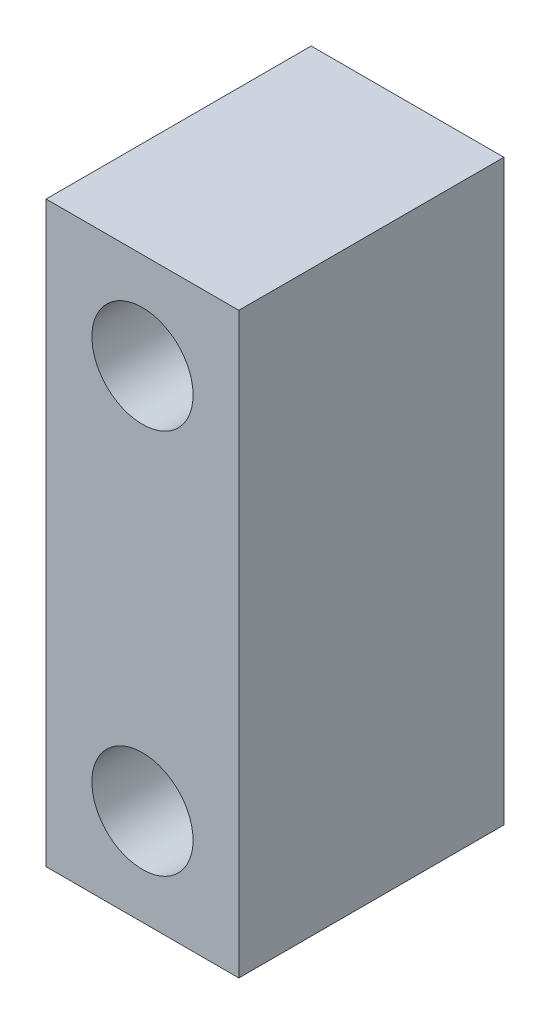
ISO-10303-21;
HEADER;
FILE_DESCRIPTION(('STEP AP214'),'2;1');
FILE_NAME('part.step','',(''),(''),'','','');
FILE_SCHEMA(('AUTOMOTIVE_DESIGN { 1 0 10303 214 1 1 1 1 }'));
ENDSEC;
DATA;
#1=APPLICATION_CONTEXT('core data for automotive mechanical design processes');
#2=APPLICATION_PROTOCOL_DEFINITION('international standard','automotive_design',2000,#1);
#3=PRODUCT_CONTEXT('',#1,'mechanical');
#4=PRODUCT('Part','Part','',(#3));
#5=PRODUCT_RELATED_PRODUCT_CATEGORY('part','',(#4));
#6=PRODUCT_DEFINITION_FORMATION('','',#4);
#7=PRODUCT_DEFINITION_CONTEXT('part definition',#1,'design');
#8=PRODUCT_DEFINITION('design','',#6,#7);
#9=PRODUCT_DEFINITION_SHAPE('','',#8);
#10=(LENGTH_UNIT() NAMED_UNIT(*) SI_UNIT(.MILLI.,.METRE.));
#11=(NAMED_UNIT(*) PLANE_ANGLE_UNIT() SI_UNIT($,.RADIAN.));
#12=(NAMED_UNIT(*) SI_UNIT($,.STERADIAN.) SOLID_ANGLE_UNIT());
#13=UNCERTAINTY_MEASURE_WITH_UNIT(LENGTH_MEASURE(1.E-05),#10,'distance_accuracy_value','');
#14=(GEOMETRIC_REPRESENTATION_CONTEXT(3) GLOBAL_UNCERTAINTY_ASSIGNED_CONTEXT((#13)) GLOBAL_UNIT_ASSIGNED_CONTEXT((#10,
#11,#12)) REPRESENTATION_CONTEXT('',''));
#15=CARTESIAN_POINT('',(0.,0.,0.));
#16=DIRECTION('',(0.,0.,1.));
#17=DIRECTION('',(1.,0.,0.));
#18=AXIS2_PLACEMENT_3D('',#15,#16,#17);
#19=CARTESIAN_POINT('',(-2.,6.,5.5));
#20=DIRECTION('',(1.,0.,0.));
#21=DIRECTION('',(0.,1.,0.));
#22=AXIS2_PLACEMENT_3D('',#19,#20,#21);
#23=PLANE('',#22);
#24=DIRECTION('',(0.,-1.,0.));
#25=VECTOR('',#24,1.);
#26=CARTESIAN_POINT('',(-2.,6.,0.));
#27=LINE('',#26,#25);
#28=CARTESIAN_POINT('',(-2.,6.,0.));
#29=VERTEX_POINT('',#28);
#30=CARTESIAN_POINT('',(-2.,-6.,0.));
#31=VERTEX_POINT('',#30);
#32=EDGE_CURVE('E96',#29,#31,#27,.T.);
#33=ORIENTED_EDGE('',*,*,#32,.T.);
#34=DIRECTION('',(0.,0.,-1.));
#35=VECTOR('',#34,1.);
#36=CARTESIAN_POINT('',(-2.,-6.,5.5));
#37=LINE('',#36,#35);
#38=CARTESIAN_POINT('',(-2.,-6.,5.5));
#39=VERTEX_POINT('',#38);
#40=EDGE_CURVE('E11',#39,#31,#37,.T.);
#41=ORIENTED_EDGE('',*,*,#40,.F.);
#42=DIRECTION('',(0.,-1.,0.));
#43=VECTOR('',#42,1.);
#44=CARTESIAN_POINT('',(-2.,6.,5.5));
#45=LINE('',#44,#43);
#46=CARTESIAN_POINT('',(-2.,6.,5.5));
#47=VERTEX_POINT('',#46);
#48=EDGE_CURVE('E84',#47,#39,#45,.T.);
#49=ORIENTED_EDGE('',*,*,#48,.F.);
#50=DIRECTION('',(0.,0.,-1.));
#51=VECTOR('',#50,1.);
#52=CARTESIAN_POINT('',(-2.,6.,5.5));
#53=LINE('',#52,#51);
#54=EDGE_CURVE('E92',#47,#29,#53,.T.);
#55=ORIENTED_EDGE('',*,*,#54,.T.);
#56=EDGE_LOOP('',(#33,#41,#49,#55));
#57=FACE_BOUND('',#56,.T.);
#58=ADVANCED_FACE('F33',(#57),#23,.F.);
#59=CARTESIAN_POINT('',(2.,-6.,5.5));
#60=DIRECTION('',(0.,1.,0.));
#61=DIRECTION('',(0.,0.,1.));
#62=AXIS2_PLACEMENT_3D('',#59,#60,#61);
#63=PLANE('',#62);
#64=DIRECTION('',(1.,0.,0.));
#65=VECTOR('',#64,1.);
#66=CARTESIAN_POINT('',(2.,-6.,0.));
#67=LINE('',#66,#65);
#68=CARTESIAN_POINT('',(2.,-6.,0.));
#69=VERTEX_POINT('',#68);
#70=EDGE_CURVE('E88',#31,#69,#67,.T.);
#71=ORIENTED_EDGE('',*,*,#70,.T.);
#72=DIRECTION('',(0.,0.,-1.));
#73=VECTOR('',#72,1.);
#74=CARTESIAN_POINT('',(2.,-6.,5.5));
#75=LINE('',#74,#73);
#76=CARTESIAN_POINT('',(2.,-6.,5.5));
#77=VERTEX_POINT('',#76);
#78=EDGE_CURVE('E41',#77,#69,#75,.T.);
#79=ORIENTED_EDGE('',*,*,#78,.F.);
#80=DIRECTION('',(1.,0.,0.));
#81=VECTOR('',#80,1.);
#82=CARTESIAN_POINT('',(2.,-6.,5.5));
#83=LINE('',#82,#81);
#84=EDGE_CURVE('E79',#39,#77,#83,.T.);
#85=ORIENTED_EDGE('',*,*,#84,.F.);
#86=ORIENTED_EDGE('',*,*,#40,.T.);
#87=EDGE_LOOP('',(#71,#79,#85,#86));
#88=FACE_BOUND('',#87,.T.);
#89=ADVANCED_FACE('F87',(#88),#63,.F.);
#90=CARTESIAN_POINT('',(2.,6.,5.5));
#91=DIRECTION('',(-1.,0.,0.));
#92=DIRECTION('',(0.,-1.,0.));
#93=AXIS2_PLACEMENT_3D('',#90,#91,#92);
#94=PLANE('',#93);
#95=DIRECTION('',(0.,1.,0.));
#96=VECTOR('',#95,1.);
#97=CARTESIAN_POINT('',(2.,6.,0.));
#98=LINE('',#97,#96);
#99=CARTESIAN_POINT('',(2.,6.,0.));
#100=VERTEX_POINT('',#99);
#101=EDGE_CURVE('E66',#69,#100,#98,.T.);
#102=ORIENTED_EDGE('',*,*,#101,.T.);
#103=DIRECTION('',(0.,0.,-1.));
#104=VECTOR('',#103,1.);
#105=CARTESIAN_POINT('',(2.,6.,5.5));
#106=LINE('',#105,#104);
#107=CARTESIAN_POINT('',(2.,6.,5.5));
#108=VERTEX_POINT('',#107);
#109=EDGE_CURVE('E89',#108,#100,#106,.T.);
#110=ORIENTED_EDGE('',*,*,#109,.F.);
#111=DIRECTION('',(0.,1.,0.));
#112=VECTOR('',#111,1.);
#113=CARTESIAN_POINT('',(2.,6.,5.5));
#114=LINE('',#113,#112);
#115=EDGE_CURVE('E82',#77,#108,#114,.T.);
#116=ORIENTED_EDGE('',*,*,#115,.F.);
#117=ORIENTED_EDGE('',*,*,#78,.T.);
#118=EDGE_LOOP('',(#102,#110,#116,#117));
#119=FACE_BOUND('',#118,.T.);
#120=ADVANCED_FACE('F90',(#119),#94,.F.);
#121=CARTESIAN_POINT('',(2.,6.,5.5));
#122=DIRECTION('',(0.,-1.,0.));
#123=DIRECTION('',(0.,0.,-1.));
#124=AXIS2_PLACEMENT_3D('',#121,#122,#123);
#125=PLANE('',#124);
#126=DIRECTION('',(-1.,0.,0.));
#127=VECTOR('',#126,1.);
#128=CARTESIAN_POINT('',(2.,6.,0.));
#129=LINE('',#128,#127);
#130=EDGE_CURVE('E72',#100,#29,#129,.T.);
#131=ORIENTED_EDGE('',*,*,#130,.T.);
#132=ORIENTED_EDGE('',*,*,#54,.F.);
#133=DIRECTION('',(-1.,0.,0.));
#134=VECTOR('',#133,1.);
#135=CARTESIAN_POINT('',(2.,6.,5.5));
#136=LINE('',#135,#134);
#137=EDGE_CURVE('E49',#108,#47,#136,.T.);
#138=ORIENTED_EDGE('',*,*,#137,.F.);
#139=ORIENTED_EDGE('',*,*,#109,.T.);
#140=EDGE_LOOP('',(#131,#132,#138,#139));
#141=FACE_BOUND('',#140,.T.);
#142=ADVANCED_FACE('F104',(#141),#125,.F.);
#143=CARTESIAN_POINT('',(0.,0.,5.5));
#144=DIRECTION('',(0.,0.,-1.));
#145=DIRECTION('',(-1.,0.,0.));
#146=AXIS2_PLACEMENT_3D('',#143,#144,#145);
#147=PLANE('',#146);
#148=CARTESIAN_POINT('',(0.,4.,5.5));
#149=DIRECTION('',(0.,0.,1.));
#150=DIRECTION('',(1.,0.,0.));
#151=AXIS2_PLACEMENT_3D('',#148,#149,#150);
#152=CIRCLE('',#151,1.05);
#153=CARTESIAN_POINT('',(1.05,4.,5.5));
#154=VERTEX_POINT('',#153);
#155=EDGE_CURVE('E116',#154,#154,#152,.T.);
#156=ORIENTED_EDGE('',*,*,#155,.F.);
#157=EDGE_LOOP('',(#156));
#158=FACE_BOUND('',#157,.T.);
#159=CARTESIAN_POINT('',(0.,-4.,5.5));
#160=DIRECTION('',(0.,0.,1.));
#161=DIRECTION('',(1.,0.,0.));
#162=AXIS2_PLACEMENT_3D('',#159,#160,#161);
#163=CIRCLE('',#162,1.05);
#164=CARTESIAN_POINT('',(1.05,-4.,5.5));
#165=VERTEX_POINT('',#164);
#166=EDGE_CURVE('E110',#165,#165,#163,.T.);
#167=ORIENTED_EDGE('',*,*,#166,.F.);
#168=EDGE_LOOP('',(#167));
#169=FACE_BOUND('',#168,.T.);
#170=ORIENTED_EDGE('',*,*,#48,.T.);
#171=ORIENTED_EDGE('',*,*,#84,.T.);
#172=ORIENTED_EDGE('',*,*,#115,.T.);
#173=ORIENTED_EDGE('',*,*,#137,.T.);
#174=EDGE_LOOP('',(#170,#171,#172,#173));
#175=FACE_BOUND('',#174,.T.);
#176=ADVANCED_FACE('F80',(#158,#169,#175),#147,.F.);
#177=CARTESIAN_POINT('',(0.,0.,0.));
#178=DIRECTION('',(0.,0.,-1.));
#179=DIRECTION('',(-1.,0.,0.));
#180=AXIS2_PLACEMENT_3D('',#177,#178,#179);
#181=PLANE('',#180);
#182=CARTESIAN_POINT('',(0.,4.,0.));
#183=DIRECTION('',(0.,0.,1.));
#184=DIRECTION('',(1.,0.,0.));
#185=AXIS2_PLACEMENT_3D('',#182,#183,#184);
#186=CIRCLE('',#185,1.05);
#187=CARTESIAN_POINT('',(1.05,4.,0.));
#188=VERTEX_POINT('',#187);
#189=EDGE_CURVE('E99',#188,#188,#186,.T.);
#190=ORIENTED_EDGE('',*,*,#189,.T.);
#191=EDGE_LOOP('',(#190));
#192=FACE_BOUND('',#191,.T.);
#193=CARTESIAN_POINT('',(0.,-4.,0.));
#194=DIRECTION('',(0.,0.,1.));
#195=DIRECTION('',(1.,0.,0.));
#196=AXIS2_PLACEMENT_3D('',#193,#194,#195);
#197=CIRCLE('',#196,1.05);
#198=CARTESIAN_POINT('',(1.05,-4.,0.));
#199=VERTEX_POINT('',#198);
#200=EDGE_CURVE('E113',#199,#199,#197,.T.);
#201=ORIENTED_EDGE('',*,*,#200,.T.);
#202=EDGE_LOOP('',(#201));
#203=FACE_BOUND('',#202,.T.);
#204=ORIENTED_EDGE('',*,*,#32,.F.);
#205=ORIENTED_EDGE('',*,*,#130,.F.);
#206=ORIENTED_EDGE('',*,*,#101,.F.);
#207=ORIENTED_EDGE('',*,*,#70,.F.);
#208=EDGE_LOOP('',(#204,#205,#206,#207));
#209=FACE_BOUND('',#208,.T.);
#210=ADVANCED_FACE('F107',(#192,#203,#209),#181,.T.);
#211=CARTESIAN_POINT('',(0.,-4.,0.));
#212=DIRECTION('',(0.,0.,1.));
#213=DIRECTION('',(1.,0.,0.));
#214=AXIS2_PLACEMENT_3D('',#211,#212,#213);
#215=CYLINDRICAL_SURFACE('',#214,1.05);
#216=ORIENTED_EDGE('',*,*,#200,.F.);
#217=EDGE_LOOP('',(#216));
#218=FACE_BOUND('',#217,.T.);
#219=ORIENTED_EDGE('',*,*,#166,.T.);
#220=EDGE_LOOP('',(#219));
#221=FACE_BOUND('',#220,.T.);
#222=ADVANCED_FACE('F127',(#218,#221),#215,.F.);
#223=CARTESIAN_POINT('',(0.,4.,0.));
#224=DIRECTION('',(0.,0.,1.));
#225=DIRECTION('',(1.,0.,0.));
#226=AXIS2_PLACEMENT_3D('',#223,#224,#225);
#227=CYLINDRICAL_SURFACE('',#226,1.05);
#228=ORIENTED_EDGE('',*,*,#189,.F.);
#229=EDGE_LOOP('',(#228));
#230=FACE_BOUND('',#229,.T.);
#231=ORIENTED_EDGE('',*,*,#155,.T.);
#232=EDGE_LOOP('',(#231));
#233=FACE_BOUND('',#232,.T.);
#234=ADVANCED_FACE('F124',(#230,#233),#227,.F.);
#235=CLOSED_SHELL('',(#58,#89,#120,#142,#176,#210,#222,#234));
#236=MANIFOLD_SOLID_BREP('B2',#235);
#237=ADVANCED_BREP_SHAPE_REPRESENTATION('',(#18,#236),#14);
#238=SHAPE_DEFINITION_REPRESENTATION(#9,#237);
ENDSEC;
END-ISO-10303-21;
